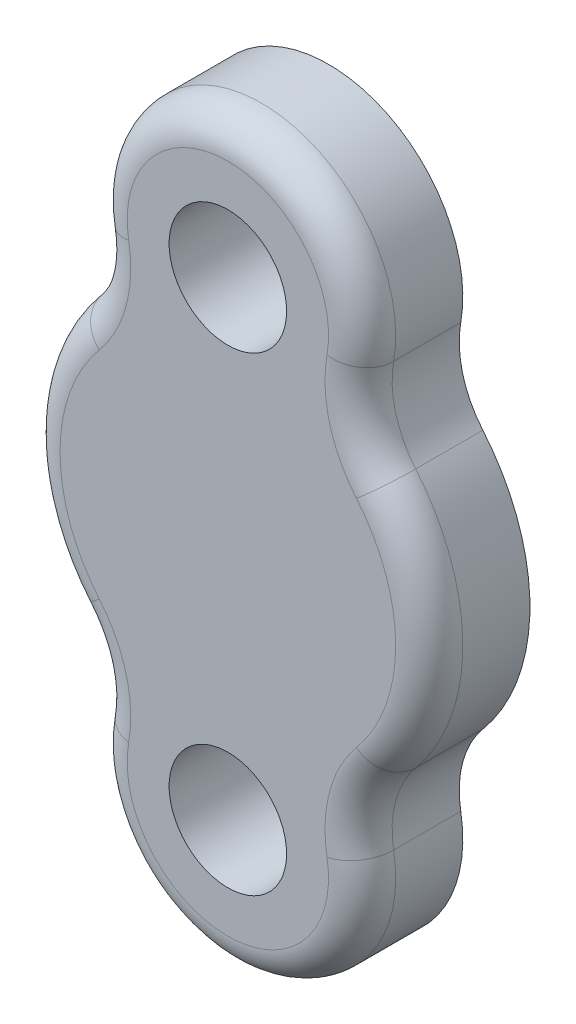
ISO-10303-21;
HEADER;
FILE_DESCRIPTION(('STEP AP214'),'2;1');
FILE_NAME('part.step','',(''),(''),'','','');
FILE_SCHEMA(('AUTOMOTIVE_DESIGN { 1 0 10303 214 1 1 1 1 }'));
ENDSEC;
DATA;
#1=APPLICATION_CONTEXT('core data for automotive mechanical design processes');
#2=APPLICATION_PROTOCOL_DEFINITION('international standard','automotive_design',2000,#1);
#3=PRODUCT_CONTEXT('',#1,'mechanical');
#4=PRODUCT('Part','Part','',(#3));
#5=PRODUCT_RELATED_PRODUCT_CATEGORY('part','',(#4));
#6=PRODUCT_DEFINITION_FORMATION('','',#4);
#7=PRODUCT_DEFINITION_CONTEXT('part definition',#1,'design');
#8=PRODUCT_DEFINITION('design','',#6,#7);
#9=PRODUCT_DEFINITION_SHAPE('','',#8);
#10=(LENGTH_UNIT() NAMED_UNIT(*) SI_UNIT(.MILLI.,.METRE.));
#11=(NAMED_UNIT(*) PLANE_ANGLE_UNIT() SI_UNIT($,.RADIAN.));
#12=(NAMED_UNIT(*) SI_UNIT($,.STERADIAN.) SOLID_ANGLE_UNIT());
#13=UNCERTAINTY_MEASURE_WITH_UNIT(LENGTH_MEASURE(1.E-05),#10,'distance_accuracy_value','');
#14=(GEOMETRIC_REPRESENTATION_CONTEXT(3) GLOBAL_UNCERTAINTY_ASSIGNED_CONTEXT((#13)) GLOBAL_UNIT_ASSIGNED_CONTEXT((#10,
#11,#12)) REPRESENTATION_CONTEXT('',''));
#15=CARTESIAN_POINT('',(0.,0.,0.));
#16=DIRECTION('',(0.,0.,1.));
#17=DIRECTION('',(1.,0.,0.));
#18=AXIS2_PLACEMENT_3D('',#15,#16,#17);
#19=CARTESIAN_POINT('',(-109.646948313016,-7.24284958499176,3.));
#20=DIRECTION('',(0.,0.,-1.));
#21=DIRECTION('',(-1.,0.,0.));
#22=AXIS2_PLACEMENT_3D('',#19,#20,#21);
#23=PLANE('',#22);
#24=CARTESIAN_POINT('',(-113.09388572919,4.9357218435797,3.));
#25=DIRECTION('',(0.,0.,-1.));
#26=DIRECTION('',(-1.,0.,0.));
#27=AXIS2_PLACEMENT_3D('',#24,#25,#26);
#28=CIRCLE('',#27,4.);
#29=CARTESIAN_POINT('',(-109.154528682134,5.62959939460008,3.));
#30=VERTEX_POINT('',#29);
#31=CARTESIAN_POINT('',(-110.029941359258,2.3642932721511,3.));
#32=VERTEX_POINT('',#31);
#33=EDGE_CURVE('E197',#30,#32,#28,.T.);
#34=ORIENTED_EDGE('',*,*,#33,.T.);
#35=CARTESIAN_POINT('',(-106.200010896842,-0.849992442134642,3.));
#36=DIRECTION('',(0.,0.,-1.));
#37=DIRECTION('',(-1.,0.,0.));
#38=AXIS2_PLACEMENT_3D('',#35,#36,#37);
#39=CIRCLE('',#38,5.00000000000001);
#40=CARTESIAN_POINT('',(-110.029941359258,-4.06427815642032,3.));
#41=VERTEX_POINT('',#40);
#42=EDGE_CURVE('E201',#32,#41,#39,.F.);
#43=ORIENTED_EDGE('',*,*,#42,.T.);
#44=CARTESIAN_POINT('',(-113.09388572919,-6.63570672784887,3.));
#45=DIRECTION('',(0.,0.,-1.));
#46=DIRECTION('',(-1.,0.,0.));
#47=AXIS2_PLACEMENT_3D('',#44,#45,#46);
#48=CIRCLE('',#47,4.);
#49=CARTESIAN_POINT('',(-109.154528682134,-7.32958427886931,3.));
#50=VERTEX_POINT('',#49);
#51=EDGE_CURVE('E199',#41,#50,#48,.T.);
#52=ORIENTED_EDGE('',*,*,#51,.T.);
#53=CARTESIAN_POINT('',(-106.200010896842,-7.84999244213464,3.));
#54=DIRECTION('',(0.,0.,-1.));
#55=DIRECTION('',(-1.,0.,0.));
#56=AXIS2_PLACEMENT_3D('',#53,#54,#55);
#57=CIRCLE('',#56,3.);
#58=CARTESIAN_POINT('',(-103.24549311155,-7.32958427886936,3.));
#59=VERTEX_POINT('',#58);
#60=EDGE_CURVE('E195',#50,#59,#57,.F.);
#61=ORIENTED_EDGE('',*,*,#60,.T.);
#62=CARTESIAN_POINT('',(-99.3061360644942,-6.63570672784898,3.));
#63=DIRECTION('',(0.,0.,-1.));
#64=DIRECTION('',(-1.,0.,0.));
#65=AXIS2_PLACEMENT_3D('',#62,#63,#64);
#66=CIRCLE('',#65,4.);
#67=CARTESIAN_POINT('',(-102.370080434427,-4.0642781564204,3.));
#68=VERTEX_POINT('',#67);
#69=EDGE_CURVE('E190',#59,#68,#66,.T.);
#70=ORIENTED_EDGE('',*,*,#69,.T.);
#71=CARTESIAN_POINT('',(-106.200010896842,-0.849992442134642,3.));
#72=DIRECTION('',(0.,0.,-1.));
#73=DIRECTION('',(-1.,0.,0.));
#74=AXIS2_PLACEMENT_3D('',#71,#72,#73);
#75=CIRCLE('',#74,5.00000000000001);
#76=CARTESIAN_POINT('',(-102.370080434427,2.36429327215103,3.));
#77=VERTEX_POINT('',#76);
#78=EDGE_CURVE('E136',#68,#77,#75,.F.);
#79=ORIENTED_EDGE('',*,*,#78,.T.);
#80=CARTESIAN_POINT('',(-99.3061360644942,4.93572184357959,3.));
#81=DIRECTION('',(0.,0.,-1.));
#82=DIRECTION('',(-1.,0.,0.));
#83=AXIS2_PLACEMENT_3D('',#80,#81,#82);
#84=CIRCLE('',#83,4.);
#85=CARTESIAN_POINT('',(-103.24549311155,5.62959939460003,3.));
#86=VERTEX_POINT('',#85);
#87=EDGE_CURVE('E188',#77,#86,#84,.T.);
#88=ORIENTED_EDGE('',*,*,#87,.T.);
#89=CARTESIAN_POINT('',(-106.200010896842,6.15000755786536,3.));
#90=DIRECTION('',(0.,0.,-1.));
#91=DIRECTION('',(-1.,0.,0.));
#92=AXIS2_PLACEMENT_3D('',#89,#90,#91);
#93=CIRCLE('',#92,3.00000000000001);
#94=EDGE_CURVE('E193',#86,#30,#93,.F.);
#95=ORIENTED_EDGE('',*,*,#94,.T.);
#96=EDGE_LOOP('',(#34,#43,#52,#61,#70,#79,#88,#95));
#97=FACE_BOUND('',#96,.T.);
#98=CARTESIAN_POINT('',(-106.200010896842,6.15000755786536,3.));
#99=DIRECTION('',(0.,0.,1.));
#100=DIRECTION('',(1.,0.,0.));
#101=AXIS2_PLACEMENT_3D('',#98,#99,#100);
#102=CIRCLE('',#101,1.75);
#103=CARTESIAN_POINT('',(-104.450010896842,6.15000755786536,3.));
#104=VERTEX_POINT('',#103);
#105=EDGE_CURVE('E153',#104,#104,#102,.T.);
#106=ORIENTED_EDGE('',*,*,#105,.F.);
#107=EDGE_LOOP('',(#106));
#108=FACE_BOUND('',#107,.T.);
#109=CARTESIAN_POINT('',(-106.200010896842,-7.84999244213464,3.));
#110=DIRECTION('',(0.,0.,1.));
#111=DIRECTION('',(1.,0.,0.));
#112=AXIS2_PLACEMENT_3D('',#109,#110,#111);
#113=CIRCLE('',#112,1.75);
#114=CARTESIAN_POINT('',(-104.450010896842,-7.84999244213464,3.));
#115=VERTEX_POINT('',#114);
#116=EDGE_CURVE('E241',#115,#115,#113,.T.);
#117=ORIENTED_EDGE('',*,*,#116,.F.);
#118=EDGE_LOOP('',(#117));
#119=FACE_BOUND('',#118,.T.);
#120=ADVANCED_FACE('F34',(#97,#108,#119),#23,.F.);
#121=CARTESIAN_POINT('',(-109.646948313016,-7.24284958499176,0.));
#122=DIRECTION('',(0.,0.,-1.));
#123=DIRECTION('',(-1.,0.,0.));
#124=AXIS2_PLACEMENT_3D('',#121,#122,#123);
#125=PLANE('',#124);
#126=CARTESIAN_POINT('',(-106.200010896842,6.15000755786536,0.));
#127=DIRECTION('',(0.,0.,1.));
#128=DIRECTION('',(1.,0.,0.));
#129=AXIS2_PLACEMENT_3D('',#126,#127,#128);
#130=CIRCLE('',#129,1.75);
#131=CARTESIAN_POINT('',(-104.450010896842,6.15000755786536,0.));
#132=VERTEX_POINT('',#131);
#133=EDGE_CURVE('E156',#132,#132,#130,.T.);
#134=ORIENTED_EDGE('',*,*,#133,.T.);
#135=EDGE_LOOP('',(#134));
#136=FACE_BOUND('',#135,.T.);
#137=CARTESIAN_POINT('',(-113.09388572919,-6.63570672784887,0.));
#138=DIRECTION('',(0.,0.,-1.));
#139=DIRECTION('',(-1.,0.,0.));
#140=AXIS2_PLACEMENT_3D('',#137,#138,#139);
#141=CIRCLE('',#140,3.);
#142=CARTESIAN_POINT('',(-110.795927451741,-4.70713529927746,0.));
#143=VERTEX_POINT('',#142);
#144=CARTESIAN_POINT('',(-110.139367943898,-7.1561148911142,0.));
#145=VERTEX_POINT('',#144);
#146=EDGE_CURVE('E144',#143,#145,#141,.T.);
#147=ORIENTED_EDGE('',*,*,#146,.F.);
#148=CARTESIAN_POINT('',(-106.200010896842,-0.849992442134642,0.));
#149=DIRECTION('',(0.,0.,1.));
#150=DIRECTION('',(1.,0.,0.));
#151=AXIS2_PLACEMENT_3D('',#148,#149,#150);
#152=CIRCLE('',#151,6.00000000000001);
#153=CARTESIAN_POINT('',(-110.795927451741,3.00715041500825,0.));
#154=VERTEX_POINT('',#153);
#155=EDGE_CURVE('E173',#154,#143,#152,.T.);
#156=ORIENTED_EDGE('',*,*,#155,.F.);
#157=CARTESIAN_POINT('',(-113.09388572919,4.9357218435797,0.));
#158=DIRECTION('',(0.,0.,-1.));
#159=DIRECTION('',(-1.,0.,0.));
#160=AXIS2_PLACEMENT_3D('',#157,#158,#159);
#161=CIRCLE('',#160,3.);
#162=CARTESIAN_POINT('',(-110.139367943898,5.45613000684498,0.));
#163=VERTEX_POINT('',#162);
#164=EDGE_CURVE('E170',#163,#154,#161,.T.);
#165=ORIENTED_EDGE('',*,*,#164,.F.);
#166=CARTESIAN_POINT('',(-106.200010896842,6.15000755786536,0.));
#167=DIRECTION('',(0.,0.,1.));
#168=DIRECTION('',(1.,0.,0.));
#169=AXIS2_PLACEMENT_3D('',#166,#167,#168);
#170=CIRCLE('',#169,4.00000000000001);
#171=CARTESIAN_POINT('',(-102.260653849786,5.45613000684492,0.));
#172=VERTEX_POINT('',#171);
#173=EDGE_CURVE('E167',#172,#163,#170,.T.);
#174=ORIENTED_EDGE('',*,*,#173,.F.);
#175=CARTESIAN_POINT('',(-99.3061360644942,4.93572184357959,0.));
#176=DIRECTION('',(0.,0.,-1.));
#177=DIRECTION('',(1.,0.,0.));
#178=AXIS2_PLACEMENT_3D('',#175,#176,#177);
#179=CIRCLE('',#178,3.);
#180=CARTESIAN_POINT('',(-101.604094341944,3.00715041500818,0.));
#181=VERTEX_POINT('',#180);
#182=EDGE_CURVE('E164',#181,#172,#179,.T.);
#183=ORIENTED_EDGE('',*,*,#182,.F.);
#184=CARTESIAN_POINT('',(-106.200010896842,-0.849992442134642,0.));
#185=DIRECTION('',(0.,0.,1.));
#186=DIRECTION('',(1.,0.,0.));
#187=AXIS2_PLACEMENT_3D('',#184,#185,#186);
#188=CIRCLE('',#187,6.00000000000001);
#189=CARTESIAN_POINT('',(-101.604094341944,-4.70713529927754,0.));
#190=VERTEX_POINT('',#189);
#191=EDGE_CURVE('E161',#190,#181,#188,.T.);
#192=ORIENTED_EDGE('',*,*,#191,.F.);
#193=CARTESIAN_POINT('',(-99.3061360644942,-6.63570672784898,0.));
#194=DIRECTION('',(0.,0.,-1.));
#195=DIRECTION('',(1.,0.,0.));
#196=AXIS2_PLACEMENT_3D('',#193,#194,#195);
#197=CIRCLE('',#196,3.);
#198=CARTESIAN_POINT('',(-102.260653849786,-7.15611489111426,0.));
#199=VERTEX_POINT('',#198);
#200=EDGE_CURVE('E147',#199,#190,#197,.T.);
#201=ORIENTED_EDGE('',*,*,#200,.F.);
#202=CARTESIAN_POINT('',(-106.200010896842,-7.84999244213464,0.));
#203=DIRECTION('',(0.,0.,1.));
#204=DIRECTION('',(1.,0.,0.));
#205=AXIS2_PLACEMENT_3D('',#202,#203,#204);
#206=CIRCLE('',#205,4.);
#207=EDGE_CURVE('E129',#145,#199,#206,.T.);
#208=ORIENTED_EDGE('',*,*,#207,.F.);
#209=EDGE_LOOP('',(#147,#156,#165,#174,#183,#192,#201,#208));
#210=FACE_BOUND('',#209,.T.);
#211=CARTESIAN_POINT('',(-106.200010896842,-7.84999244213464,0.));
#212=DIRECTION('',(0.,0.,1.));
#213=DIRECTION('',(1.,0.,0.));
#214=AXIS2_PLACEMENT_3D('',#211,#212,#213);
#215=CIRCLE('',#214,1.75);
#216=CARTESIAN_POINT('',(-104.450010896842,-7.84999244213464,0.));
#217=VERTEX_POINT('',#216);
#218=EDGE_CURVE('E235',#217,#217,#215,.T.);
#219=ORIENTED_EDGE('',*,*,#218,.T.);
#220=EDGE_LOOP('',(#219));
#221=FACE_BOUND('',#220,.T.);
#222=ADVANCED_FACE('F141',(#136,#210,#221),#125,.T.);
#223=CARTESIAN_POINT('',(-113.09388572919,-6.63570672784887,3.));
#224=DIRECTION('',(0.,0.,-1.));
#225=DIRECTION('',(-1.,0.,0.));
#226=AXIS2_PLACEMENT_3D('',#223,#224,#225);
#227=CYLINDRICAL_SURFACE('',#226,3.);
#228=DIRECTION('',(0.,0.,-1.));
#229=VECTOR('',#228,1.);
#230=CARTESIAN_POINT('',(-110.139367943898,-7.1561148911142,3.));
#231=LINE('',#230,#229);
#232=CARTESIAN_POINT('',(-110.139367943898,-7.1561148911142,2.));
#233=VERTEX_POINT('',#232);
#234=EDGE_CURVE('E125',#233,#145,#231,.T.);
#235=ORIENTED_EDGE('',*,*,#234,.F.);
#236=CARTESIAN_POINT('',(-113.09388572919,-6.63570672784887,2.));
#237=DIRECTION('',(0.,0.,-1.));
#238=DIRECTION('',(-1.,0.,0.));
#239=AXIS2_PLACEMENT_3D('',#236,#237,#238);
#240=CIRCLE('',#239,3.);
#241=CARTESIAN_POINT('',(-110.795927451741,-4.70713529927746,2.));
#242=VERTEX_POINT('',#241);
#243=EDGE_CURVE('E206',#233,#242,#240,.F.);
#244=ORIENTED_EDGE('',*,*,#243,.T.);
#245=DIRECTION('',(0.,0.,-1.));
#246=VECTOR('',#245,1.);
#247=CARTESIAN_POINT('',(-110.795927451741,-4.70713529927746,3.));
#248=LINE('',#247,#246);
#249=EDGE_CURVE('E151',#242,#143,#248,.T.);
#250=ORIENTED_EDGE('',*,*,#249,.T.);
#251=ORIENTED_EDGE('',*,*,#146,.T.);
#252=EDGE_LOOP('',(#235,#244,#250,#251));
#253=FACE_BOUND('',#252,.T.);
#254=ADVANCED_FACE('F149',(#253),#227,.F.);
#255=CARTESIAN_POINT('',(-106.200010896842,-7.84999244213464,3.));
#256=DIRECTION('',(0.,0.,-1.));
#257=DIRECTION('',(-1.,0.,0.));
#258=AXIS2_PLACEMENT_3D('',#255,#256,#257);
#259=CYLINDRICAL_SURFACE('',#258,4.);
#260=DIRECTION('',(0.,0.,-1.));
#261=VECTOR('',#260,1.);
#262=CARTESIAN_POINT('',(-102.260653849786,-7.15611489111426,3.));
#263=LINE('',#262,#261);
#264=CARTESIAN_POINT('',(-102.260653849786,-7.15611489111426,2.));
#265=VERTEX_POINT('',#264);
#266=EDGE_CURVE('E137',#265,#199,#263,.T.);
#267=ORIENTED_EDGE('',*,*,#266,.F.);
#268=CARTESIAN_POINT('',(-106.200010896842,-7.84999244213464,2.));
#269=DIRECTION('',(0.,0.,-1.));
#270=DIRECTION('',(-1.,0.,0.));
#271=AXIS2_PLACEMENT_3D('',#268,#269,#270);
#272=CIRCLE('',#271,4.);
#273=EDGE_CURVE('E132',#265,#233,#272,.T.);
#274=ORIENTED_EDGE('',*,*,#273,.T.);
#275=ORIENTED_EDGE('',*,*,#234,.T.);
#276=ORIENTED_EDGE('',*,*,#207,.T.);
#277=EDGE_LOOP('',(#267,#274,#275,#276));
#278=FACE_BOUND('',#277,.T.);
#279=ADVANCED_FACE('F128',(#278),#259,.T.);
#280=CARTESIAN_POINT('',(-99.3061360644942,-6.63570672784898,3.));
#281=DIRECTION('',(0.,0.,-1.));
#282=DIRECTION('',(-1.,0.,0.));
#283=AXIS2_PLACEMENT_3D('',#280,#281,#282);
#284=CYLINDRICAL_SURFACE('',#283,3.);
#285=DIRECTION('',(0.,0.,-1.));
#286=VECTOR('',#285,1.);
#287=CARTESIAN_POINT('',(-101.604094341944,-4.70713529927754,3.));
#288=LINE('',#287,#286);
#289=CARTESIAN_POINT('',(-101.604094341944,-4.70713529927754,2.));
#290=VERTEX_POINT('',#289);
#291=EDGE_CURVE('E184',#290,#190,#288,.T.);
#292=ORIENTED_EDGE('',*,*,#291,.F.);
#293=CARTESIAN_POINT('',(-99.3061360644942,-6.63570672784898,2.));
#294=DIRECTION('',(0.,0.,-1.));
#295=DIRECTION('',(-1.,0.,0.));
#296=AXIS2_PLACEMENT_3D('',#293,#294,#295);
#297=CIRCLE('',#296,3.);
#298=EDGE_CURVE('E203',#290,#265,#297,.F.);
#299=ORIENTED_EDGE('',*,*,#298,.T.);
#300=ORIENTED_EDGE('',*,*,#266,.T.);
#301=ORIENTED_EDGE('',*,*,#200,.T.);
#302=EDGE_LOOP('',(#292,#299,#300,#301));
#303=FACE_BOUND('',#302,.T.);
#304=ADVANCED_FACE('F287',(#303),#284,.F.);
#305=CARTESIAN_POINT('',(-106.200010896842,-0.849992442134642,3.));
#306=DIRECTION('',(0.,0.,-1.));
#307=DIRECTION('',(-1.,0.,0.));
#308=AXIS2_PLACEMENT_3D('',#305,#306,#307);
#309=CYLINDRICAL_SURFACE('',#308,6.00000000000001);
#310=DIRECTION('',(0.,0.,-1.));
#311=VECTOR('',#310,1.);
#312=CARTESIAN_POINT('',(-101.604094341944,3.00715041500818,3.));
#313=LINE('',#312,#311);
#314=CARTESIAN_POINT('',(-101.604094341944,3.00715041500818,2.));
#315=VERTEX_POINT('',#314);
#316=EDGE_CURVE('E182',#315,#181,#313,.T.);
#317=ORIENTED_EDGE('',*,*,#316,.F.);
#318=CARTESIAN_POINT('',(-106.200010896842,-0.849992442134642,2.));
#319=DIRECTION('',(0.,0.,-1.));
#320=DIRECTION('',(-1.,0.,0.));
#321=AXIS2_PLACEMENT_3D('',#318,#319,#320);
#322=CIRCLE('',#321,6.00000000000001);
#323=EDGE_CURVE('E11',#315,#290,#322,.T.);
#324=ORIENTED_EDGE('',*,*,#323,.T.);
#325=ORIENTED_EDGE('',*,*,#291,.T.);
#326=ORIENTED_EDGE('',*,*,#191,.T.);
#327=EDGE_LOOP('',(#317,#324,#325,#326));
#328=FACE_BOUND('',#327,.T.);
#329=ADVANCED_FACE('F284',(#328),#309,.T.);
#330=CARTESIAN_POINT('',(-99.3061360644942,4.93572184357959,3.));
#331=DIRECTION('',(0.,0.,-1.));
#332=DIRECTION('',(-1.,0.,0.));
#333=AXIS2_PLACEMENT_3D('',#330,#331,#332);
#334=CYLINDRICAL_SURFACE('',#333,3.);
#335=DIRECTION('',(0.,0.,-1.));
#336=VECTOR('',#335,1.);
#337=CARTESIAN_POINT('',(-102.260653849786,5.45613000684492,3.));
#338=LINE('',#337,#336);
#339=CARTESIAN_POINT('',(-102.260653849786,5.45613000684492,2.));
#340=VERTEX_POINT('',#339);
#341=EDGE_CURVE('E180',#340,#172,#338,.T.);
#342=ORIENTED_EDGE('',*,*,#341,.F.);
#343=CARTESIAN_POINT('',(-99.3061360644942,4.93572184357959,2.));
#344=DIRECTION('',(0.,0.,-1.));
#345=DIRECTION('',(-1.,0.,0.));
#346=AXIS2_PLACEMENT_3D('',#343,#344,#345);
#347=CIRCLE('',#346,3.);
#348=EDGE_CURVE('E51',#340,#315,#347,.F.);
#349=ORIENTED_EDGE('',*,*,#348,.T.);
#350=ORIENTED_EDGE('',*,*,#316,.T.);
#351=ORIENTED_EDGE('',*,*,#182,.T.);
#352=EDGE_LOOP('',(#342,#349,#350,#351));
#353=FACE_BOUND('',#352,.T.);
#354=ADVANCED_FACE('F281',(#353),#334,.F.);
#355=CARTESIAN_POINT('',(-106.200010896842,6.15000755786536,3.));
#356=DIRECTION('',(0.,0.,-1.));
#357=DIRECTION('',(-1.,0.,0.));
#358=AXIS2_PLACEMENT_3D('',#355,#356,#357);
#359=CYLINDRICAL_SURFACE('',#358,4.00000000000001);
#360=DIRECTION('',(0.,0.,-1.));
#361=VECTOR('',#360,1.);
#362=CARTESIAN_POINT('',(-110.139367943898,5.45613000684498,3.));
#363=LINE('',#362,#361);
#364=CARTESIAN_POINT('',(-110.139367943898,5.45613000684498,2.));
#365=VERTEX_POINT('',#364);
#366=EDGE_CURVE('E178',#365,#163,#363,.T.);
#367=ORIENTED_EDGE('',*,*,#366,.F.);
#368=CARTESIAN_POINT('',(-106.200010896842,6.15000755786536,2.));
#369=DIRECTION('',(0.,0.,-1.));
#370=DIRECTION('',(-1.,0.,0.));
#371=AXIS2_PLACEMENT_3D('',#368,#369,#370);
#372=CIRCLE('',#371,4.00000000000001);
#373=EDGE_CURVE('E59',#365,#340,#372,.T.);
#374=ORIENTED_EDGE('',*,*,#373,.T.);
#375=ORIENTED_EDGE('',*,*,#341,.T.);
#376=ORIENTED_EDGE('',*,*,#173,.T.);
#377=EDGE_LOOP('',(#367,#374,#375,#376));
#378=FACE_BOUND('',#377,.T.);
#379=ADVANCED_FACE('F277',(#378),#359,.T.);
#380=CARTESIAN_POINT('',(-113.09388572919,4.9357218435797,3.));
#381=DIRECTION('',(0.,0.,-1.));
#382=DIRECTION('',(-1.,0.,0.));
#383=AXIS2_PLACEMENT_3D('',#380,#381,#382);
#384=CYLINDRICAL_SURFACE('',#383,3.);
#385=DIRECTION('',(0.,0.,-1.));
#386=VECTOR('',#385,1.);
#387=CARTESIAN_POINT('',(-110.795927451741,3.00715041500825,3.));
#388=LINE('',#387,#386);
#389=CARTESIAN_POINT('',(-110.795927451741,3.00715041500825,2.));
#390=VERTEX_POINT('',#389);
#391=EDGE_CURVE('E176',#390,#154,#388,.T.);
#392=ORIENTED_EDGE('',*,*,#391,.F.);
#393=CARTESIAN_POINT('',(-113.09388572919,4.9357218435797,2.));
#394=DIRECTION('',(0.,0.,-1.));
#395=DIRECTION('',(-1.,0.,0.));
#396=AXIS2_PLACEMENT_3D('',#393,#394,#395);
#397=CIRCLE('',#396,3.);
#398=EDGE_CURVE('E208',#390,#365,#397,.F.);
#399=ORIENTED_EDGE('',*,*,#398,.T.);
#400=ORIENTED_EDGE('',*,*,#366,.T.);
#401=ORIENTED_EDGE('',*,*,#164,.T.);
#402=EDGE_LOOP('',(#392,#399,#400,#401));
#403=FACE_BOUND('',#402,.T.);
#404=ADVANCED_FACE('F263',(#403),#384,.F.);
#405=CARTESIAN_POINT('',(-106.200010896842,-0.849992442134642,3.));
#406=DIRECTION('',(0.,0.,-1.));
#407=DIRECTION('',(-1.,0.,0.));
#408=AXIS2_PLACEMENT_3D('',#405,#406,#407);
#409=CYLINDRICAL_SURFACE('',#408,6.00000000000001);
#410=ORIENTED_EDGE('',*,*,#249,.F.);
#411=CARTESIAN_POINT('',(-106.200010896842,-0.849992442134642,2.));
#412=DIRECTION('',(0.,0.,-1.));
#413=DIRECTION('',(-1.,0.,0.));
#414=AXIS2_PLACEMENT_3D('',#411,#412,#413);
#415=CIRCLE('',#414,6.00000000000001);
#416=EDGE_CURVE('E43',#242,#390,#415,.T.);
#417=ORIENTED_EDGE('',*,*,#416,.T.);
#418=ORIENTED_EDGE('',*,*,#391,.T.);
#419=ORIENTED_EDGE('',*,*,#155,.T.);
#420=EDGE_LOOP('',(#410,#417,#418,#419));
#421=FACE_BOUND('',#420,.T.);
#422=ADVANCED_FACE('F255',(#421),#409,.T.);
#423=CARTESIAN_POINT('',(-106.200010896842,6.15000755786536,3.));
#424=DIRECTION('',(0.,0.,-1.));
#425=DIRECTION('',(-1.,0.,0.));
#426=AXIS2_PLACEMENT_3D('',#423,#424,#425);
#427=CYLINDRICAL_SURFACE('',#426,1.75);
#428=ORIENTED_EDGE('',*,*,#105,.T.);
#429=EDGE_LOOP('',(#428));
#430=FACE_BOUND('',#429,.T.);
#431=ORIENTED_EDGE('',*,*,#133,.F.);
#432=EDGE_LOOP('',(#431));
#433=FACE_BOUND('',#432,.T.);
#434=ADVANCED_FACE('F252',(#430,#433),#427,.F.);
#435=CARTESIAN_POINT('',(-106.200010896842,-7.84999244213464,3.));
#436=DIRECTION('',(0.,0.,-1.));
#437=DIRECTION('',(-1.,0.,0.));
#438=AXIS2_PLACEMENT_3D('',#435,#436,#437);
#439=CYLINDRICAL_SURFACE('',#438,1.75);
#440=ORIENTED_EDGE('',*,*,#116,.T.);
#441=EDGE_LOOP('',(#440));
#442=FACE_BOUND('',#441,.T.);
#443=ORIENTED_EDGE('',*,*,#218,.F.);
#444=EDGE_LOOP('',(#443));
#445=FACE_BOUND('',#444,.T.);
#446=ADVANCED_FACE('F254',(#442,#445),#439,.F.);
#447=CARTESIAN_POINT('',(-113.09388572919,4.9357218435797,2.));
#448=DIRECTION('',(0.,0.,-1.));
#449=DIRECTION('',(-1.,0.,0.));
#450=AXIS2_PLACEMENT_3D('',#447,#448,#449);
#451=TOROIDAL_SURFACE('',#450,4.,1.);
#452=CARTESIAN_POINT('',(-109.154528682134,5.62959939460007,2.));
#453=DIRECTION('',(-0.173469387755095,0.984839261764006,0.));
#454=DIRECTION('',(-0.984839261764006,-0.173469387755095,0.));
#455=AXIS2_PLACEMENT_3D('',#452,#453,#454);
#456=CIRCLE('',#455,1.);
#457=EDGE_CURVE('E229',#365,#30,#456,.T.);
#458=ORIENTED_EDGE('',*,*,#457,.F.);
#459=ORIENTED_EDGE('',*,*,#398,.F.);
#460=CARTESIAN_POINT('',(-110.029941359258,2.3642932721511,2.));
#461=DIRECTION('',(-0.642857142857145,-0.765986092483113,0.));
#462=DIRECTION('',(0.765986092483113,-0.642857142857145,0.));
#463=AXIS2_PLACEMENT_3D('',#460,#461,#462);
#464=CIRCLE('',#463,1.);
#465=EDGE_CURVE('E38',#32,#390,#464,.T.);
#466=ORIENTED_EDGE('',*,*,#465,.F.);
#467=ORIENTED_EDGE('',*,*,#33,.F.);
#468=EDGE_LOOP('',(#458,#459,#466,#467));
#469=FACE_BOUND('',#468,.T.);
#470=ADVANCED_FACE('F36',(#469),#451,.T.);
#471=CARTESIAN_POINT('',(-106.200010896842,-0.849992442134642,2.));
#472=DIRECTION('',(0.,0.,-1.));
#473=DIRECTION('',(-1.,0.,0.));
#474=AXIS2_PLACEMENT_3D('',#471,#472,#473);
#475=TOROIDAL_SURFACE('',#474,5.00000000000001,1.);
#476=ORIENTED_EDGE('',*,*,#465,.T.);
#477=ORIENTED_EDGE('',*,*,#416,.F.);
#478=CARTESIAN_POINT('',(-110.029941359258,-4.06427815642033,2.));
#479=DIRECTION('',(0.642857142857138,-0.765986092483119,0.));
#480=DIRECTION('',(0.765986092483119,0.642857142857138,0.));
#481=AXIS2_PLACEMENT_3D('',#478,#479,#480);
#482=CIRCLE('',#481,1.);
#483=EDGE_CURVE('E227',#41,#242,#482,.T.);
#484=ORIENTED_EDGE('',*,*,#483,.F.);
#485=ORIENTED_EDGE('',*,*,#42,.F.);
#486=EDGE_LOOP('',(#476,#477,#484,#485));
#487=FACE_BOUND('',#486,.T.);
#488=ADVANCED_FACE('F318',(#487),#475,.T.);
#489=CARTESIAN_POINT('',(-106.200010896842,6.15000755786536,2.));
#490=DIRECTION('',(0.,0.,-1.));
#491=DIRECTION('',(-1.,0.,0.));
#492=AXIS2_PLACEMENT_3D('',#489,#490,#491);
#493=TOROIDAL_SURFACE('',#492,3.00000000000001,1.);
#494=ORIENTED_EDGE('',*,*,#457,.T.);
#495=ORIENTED_EDGE('',*,*,#94,.F.);
#496=CARTESIAN_POINT('',(-103.24549311155,5.62959939460003,2.));
#497=DIRECTION('',(-0.17346938775511,-0.984839261764003,0.));
#498=DIRECTION('',(0.984839261764003,-0.17346938775511,0.));
#499=AXIS2_PLACEMENT_3D('',#496,#497,#498);
#500=CIRCLE('',#499,1.);
#501=EDGE_CURVE('E224',#340,#86,#500,.T.);
#502=ORIENTED_EDGE('',*,*,#501,.F.);
#503=ORIENTED_EDGE('',*,*,#373,.F.);
#504=EDGE_LOOP('',(#494,#495,#502,#503));
#505=FACE_BOUND('',#504,.T.);
#506=ADVANCED_FACE('F315',(#505),#493,.T.);
#507=CARTESIAN_POINT('',(-113.09388572919,-6.63570672784887,2.));
#508=DIRECTION('',(0.,0.,-1.));
#509=DIRECTION('',(-1.,0.,0.));
#510=AXIS2_PLACEMENT_3D('',#507,#508,#509);
#511=TOROIDAL_SURFACE('',#510,4.,1.);
#512=ORIENTED_EDGE('',*,*,#483,.T.);
#513=ORIENTED_EDGE('',*,*,#243,.F.);
#514=CARTESIAN_POINT('',(-109.154528682134,-7.32958427886931,2.));
#515=DIRECTION('',(-0.173469387755111,-0.984839261764003,0.));
#516=DIRECTION('',(0.984839261764003,-0.173469387755111,0.));
#517=AXIS2_PLACEMENT_3D('',#514,#515,#516);
#518=CIRCLE('',#517,1.);
#519=EDGE_CURVE('E221',#50,#233,#518,.T.);
#520=ORIENTED_EDGE('',*,*,#519,.F.);
#521=ORIENTED_EDGE('',*,*,#51,.F.);
#522=EDGE_LOOP('',(#512,#513,#520,#521));
#523=FACE_BOUND('',#522,.T.);
#524=ADVANCED_FACE('F311',(#523),#511,.T.);
#525=CARTESIAN_POINT('',(-99.3061360644942,4.93572184357959,2.));
#526=DIRECTION('',(0.,0.,-1.));
#527=DIRECTION('',(-1.,0.,0.));
#528=AXIS2_PLACEMENT_3D('',#525,#526,#527);
#529=TOROIDAL_SURFACE('',#528,4.,1.);
#530=ORIENTED_EDGE('',*,*,#501,.T.);
#531=ORIENTED_EDGE('',*,*,#87,.F.);
#532=CARTESIAN_POINT('',(-102.370080434427,2.36429327215104,2.));
#533=DIRECTION('',(0.64285714285714,-0.765986092483117,0.));
#534=DIRECTION('',(0.765986092483117,0.64285714285714,0.));
#535=AXIS2_PLACEMENT_3D('',#532,#533,#534);
#536=CIRCLE('',#535,1.);
#537=EDGE_CURVE('E218',#315,#77,#536,.T.);
#538=ORIENTED_EDGE('',*,*,#537,.F.);
#539=ORIENTED_EDGE('',*,*,#348,.F.);
#540=EDGE_LOOP('',(#530,#531,#538,#539));
#541=FACE_BOUND('',#540,.T.);
#542=ADVANCED_FACE('F307',(#541),#529,.T.);
#543=CARTESIAN_POINT('',(-106.200010896842,-7.84999244213464,2.));
#544=DIRECTION('',(0.,0.,-1.));
#545=DIRECTION('',(-1.,0.,0.));
#546=AXIS2_PLACEMENT_3D('',#543,#544,#545);
#547=TOROIDAL_SURFACE('',#546,3.,1.);
#548=ORIENTED_EDGE('',*,*,#519,.T.);
#549=ORIENTED_EDGE('',*,*,#273,.F.);
#550=CARTESIAN_POINT('',(-103.24549311155,-7.32958427886936,2.));
#551=DIRECTION('',(-0.173469387755095,0.984839261764006,0.));
#552=DIRECTION('',(-0.984839261764006,-0.173469387755095,0.));
#553=AXIS2_PLACEMENT_3D('',#550,#551,#552);
#554=CIRCLE('',#553,1.);
#555=EDGE_CURVE('E216',#59,#265,#554,.T.);
#556=ORIENTED_EDGE('',*,*,#555,.F.);
#557=ORIENTED_EDGE('',*,*,#60,.F.);
#558=EDGE_LOOP('',(#548,#549,#556,#557));
#559=FACE_BOUND('',#558,.T.);
#560=ADVANCED_FACE('F303',(#559),#547,.T.);
#561=CARTESIAN_POINT('',(-106.200010896842,-0.849992442134642,2.));
#562=DIRECTION('',(0.,0.,-1.));
#563=DIRECTION('',(-1.,0.,0.));
#564=AXIS2_PLACEMENT_3D('',#561,#562,#563);
#565=TOROIDAL_SURFACE('',#564,5.00000000000001,1.);
#566=ORIENTED_EDGE('',*,*,#537,.T.);
#567=ORIENTED_EDGE('',*,*,#78,.F.);
#568=CARTESIAN_POINT('',(-102.370080434427,-4.06427815642039,2.));
#569=DIRECTION('',(-0.642857142857147,-0.765986092483111,0.));
#570=DIRECTION('',(0.765986092483111,-0.642857142857147,0.));
#571=AXIS2_PLACEMENT_3D('',#568,#569,#570);
#572=CIRCLE('',#571,1.);
#573=EDGE_CURVE('E214',#290,#68,#572,.T.);
#574=ORIENTED_EDGE('',*,*,#573,.F.);
#575=ORIENTED_EDGE('',*,*,#323,.F.);
#576=EDGE_LOOP('',(#566,#567,#574,#575));
#577=FACE_BOUND('',#576,.T.);
#578=ADVANCED_FACE('F299',(#577),#565,.T.);
#579=CARTESIAN_POINT('',(-99.3061360644942,-6.63570672784898,2.));
#580=DIRECTION('',(0.,0.,-1.));
#581=DIRECTION('',(-1.,0.,0.));
#582=AXIS2_PLACEMENT_3D('',#579,#580,#581);
#583=TOROIDAL_SURFACE('',#582,4.,1.);
#584=ORIENTED_EDGE('',*,*,#555,.T.);
#585=ORIENTED_EDGE('',*,*,#298,.F.);
#586=ORIENTED_EDGE('',*,*,#573,.T.);
#587=ORIENTED_EDGE('',*,*,#69,.F.);
#588=EDGE_LOOP('',(#584,#585,#586,#587));
#589=FACE_BOUND('',#588,.T.);
#590=ADVANCED_FACE('F296',(#589),#583,.T.);
#591=CLOSED_SHELL('',(#120,#222,#254,#279,#304,#329,#354,#379,#404,#422,#434,#446,#470,#488,
#506,#524,#542,#560,#578,#590));
#592=MANIFOLD_SOLID_BREP('B2',#591);
#593=ADVANCED_BREP_SHAPE_REPRESENTATION('',(#18,#592),#14);
#594=SHAPE_DEFINITION_REPRESENTATION(#9,#593);
ENDSEC;
END-ISO-10303-21;
